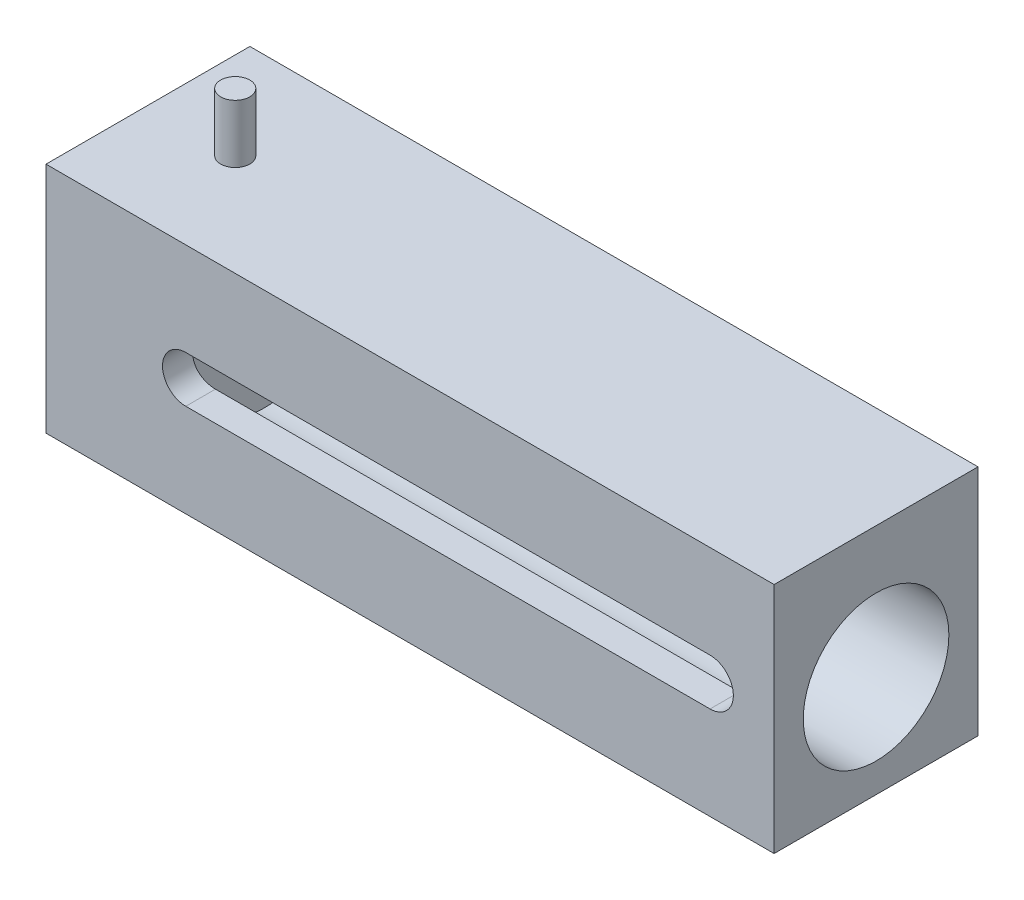
ISO-10303-21;
HEADER;
FILE_DESCRIPTION(('STEP AP214'),'2;1');
FILE_NAME('part.step','',(''),(''),'','','');
FILE_SCHEMA(('AUTOMOTIVE_DESIGN { 1 0 10303 214 1 1 1 1 }'));
ENDSEC;
DATA;
#1=APPLICATION_CONTEXT('core data for automotive mechanical design processes');
#2=APPLICATION_PROTOCOL_DEFINITION('international standard','automotive_design',2000,#1);
#3=PRODUCT_CONTEXT('',#1,'mechanical');
#4=PRODUCT('Part','Part','',(#3));
#5=PRODUCT_RELATED_PRODUCT_CATEGORY('part','',(#4));
#6=PRODUCT_DEFINITION_FORMATION('','',#4);
#7=PRODUCT_DEFINITION_CONTEXT('part definition',#1,'design');
#8=PRODUCT_DEFINITION('design','',#6,#7);
#9=PRODUCT_DEFINITION_SHAPE('','',#8);
#10=(LENGTH_UNIT() NAMED_UNIT(*) SI_UNIT(.MILLI.,.METRE.));
#11=(NAMED_UNIT(*) PLANE_ANGLE_UNIT() SI_UNIT($,.RADIAN.));
#12=(NAMED_UNIT(*) SI_UNIT($,.STERADIAN.) SOLID_ANGLE_UNIT());
#13=UNCERTAINTY_MEASURE_WITH_UNIT(LENGTH_MEASURE(1.E-05),#10,'distance_accuracy_value','');
#14=(GEOMETRIC_REPRESENTATION_CONTEXT(3) GLOBAL_UNCERTAINTY_ASSIGNED_CONTEXT((#13)) GLOBAL_UNIT_ASSIGNED_CONTEXT((#10,
#11,#12)) REPRESENTATION_CONTEXT('',''));
#15=CARTESIAN_POINT('',(0.,0.,0.));
#16=DIRECTION('',(0.,0.,1.));
#17=DIRECTION('',(1.,0.,0.));
#18=AXIS2_PLACEMENT_3D('',#15,#16,#17);
#19=CARTESIAN_POINT('',(125.,80.,-35.));
#20=DIRECTION('',(-1.,0.,0.));
#21=DIRECTION('',(0.,0.,1.));
#22=AXIS2_PLACEMENT_3D('',#19,#20,#21);
#23=PLANE('',#22);
#24=CARTESIAN_POINT('',(125.,35.,0.));
#25=DIRECTION('',(1.,0.,0.));
#26=DIRECTION('',(0.,0.,-1.));
#27=AXIS2_PLACEMENT_3D('',#24,#25,#26);
#28=CIRCLE('',#27,25.);
#29=CARTESIAN_POINT('',(125.,35.,-25.));
#30=VERTEX_POINT('',#29);
#31=EDGE_CURVE('E116',#30,#30,#28,.T.);
#32=ORIENTED_EDGE('',*,*,#31,.F.);
#33=EDGE_LOOP('',(#32));
#34=FACE_BOUND('',#33,.T.);
#35=DIRECTION('',(0.,0.,-1.));
#36=VECTOR('',#35,1.);
#37=CARTESIAN_POINT('',(125.,0.,-35.));
#38=LINE('',#37,#36);
#39=CARTESIAN_POINT('',(125.,0.,35.));
#40=VERTEX_POINT('',#39);
#41=CARTESIAN_POINT('',(125.,0.,-35.));
#42=VERTEX_POINT('',#41);
#43=EDGE_CURVE('E183',#40,#42,#38,.T.);
#44=ORIENTED_EDGE('',*,*,#43,.T.);
#45=DIRECTION('',(0.,-1.,0.));
#46=VECTOR('',#45,1.);
#47=CARTESIAN_POINT('',(125.,80.,-35.));
#48=LINE('',#47,#46);
#49=CARTESIAN_POINT('',(125.,80.,-35.));
#50=VERTEX_POINT('',#49);
#51=EDGE_CURVE('E12',#50,#42,#48,.T.);
#52=ORIENTED_EDGE('',*,*,#51,.F.);
#53=DIRECTION('',(0.,0.,-1.));
#54=VECTOR('',#53,1.);
#55=CARTESIAN_POINT('',(125.,80.,-35.));
#56=LINE('',#55,#54);
#57=CARTESIAN_POINT('',(125.,80.,35.));
#58=VERTEX_POINT('',#57);
#59=EDGE_CURVE('E203',#58,#50,#56,.T.);
#60=ORIENTED_EDGE('',*,*,#59,.F.);
#61=DIRECTION('',(0.,-1.,0.));
#62=VECTOR('',#61,1.);
#63=CARTESIAN_POINT('',(125.,80.,35.));
#64=LINE('',#63,#62);
#65=EDGE_CURVE('E186',#58,#40,#64,.T.);
#66=ORIENTED_EDGE('',*,*,#65,.T.);
#67=EDGE_LOOP('',(#44,#52,#60,#66));
#68=FACE_BOUND('',#67,.T.);
#69=ADVANCED_FACE('F37',(#34,#68),#23,.F.);
#70=CARTESIAN_POINT('',(-125.,80.,-35.));
#71=DIRECTION('',(0.,0.,1.));
#72=DIRECTION('',(1.,0.,0.));
#73=AXIS2_PLACEMENT_3D('',#70,#71,#72);
#74=PLANE('',#73);
#75=DIRECTION('',(-1.,0.,0.));
#76=VECTOR('',#75,1.);
#77=CARTESIAN_POINT('',(-125.,0.,-35.));
#78=LINE('',#77,#76);
#79=CARTESIAN_POINT('',(-125.,0.,-35.));
#80=VERTEX_POINT('',#79);
#81=EDGE_CURVE('E189',#42,#80,#78,.T.);
#82=ORIENTED_EDGE('',*,*,#81,.T.);
#83=DIRECTION('',(0.,-1.,0.));
#84=VECTOR('',#83,1.);
#85=CARTESIAN_POINT('',(-125.,80.,-35.));
#86=LINE('',#85,#84);
#87=CARTESIAN_POINT('',(-125.,80.,-35.));
#88=VERTEX_POINT('',#87);
#89=EDGE_CURVE('E44',#88,#80,#86,.T.);
#90=ORIENTED_EDGE('',*,*,#89,.F.);
#91=DIRECTION('',(-1.,0.,0.));
#92=VECTOR('',#91,1.);
#93=CARTESIAN_POINT('',(-125.,80.,-35.));
#94=LINE('',#93,#92);
#95=EDGE_CURVE('E220',#50,#88,#94,.T.);
#96=ORIENTED_EDGE('',*,*,#95,.F.);
#97=ORIENTED_EDGE('',*,*,#51,.T.);
#98=EDGE_LOOP('',(#82,#90,#96,#97));
#99=FACE_BOUND('',#98,.T.);
#100=ADVANCED_FACE('F167',(#99),#74,.F.);
#101=CARTESIAN_POINT('',(-125.,80.,-35.));
#102=DIRECTION('',(1.,0.,0.));
#103=DIRECTION('',(0.,0.,-1.));
#104=AXIS2_PLACEMENT_3D('',#101,#102,#103);
#105=PLANE('',#104);
#106=DIRECTION('',(0.,0.,1.));
#107=VECTOR('',#106,1.);
#108=CARTESIAN_POINT('',(-125.,0.,-35.));
#109=LINE('',#108,#107);
#110=CARTESIAN_POINT('',(-125.,0.,35.));
#111=VERTEX_POINT('',#110);
#112=EDGE_CURVE('E192',#80,#111,#109,.T.);
#113=ORIENTED_EDGE('',*,*,#112,.T.);
#114=DIRECTION('',(0.,-1.,0.));
#115=VECTOR('',#114,1.);
#116=CARTESIAN_POINT('',(-125.,80.,35.));
#117=LINE('',#116,#115);
#118=CARTESIAN_POINT('',(-125.,80.,35.));
#119=VERTEX_POINT('',#118);
#120=EDGE_CURVE('E205',#119,#111,#117,.T.);
#121=ORIENTED_EDGE('',*,*,#120,.F.);
#122=DIRECTION('',(0.,0.,1.));
#123=VECTOR('',#122,1.);
#124=CARTESIAN_POINT('',(-125.,80.,-35.));
#125=LINE('',#124,#123);
#126=EDGE_CURVE('E213',#88,#119,#125,.T.);
#127=ORIENTED_EDGE('',*,*,#126,.F.);
#128=ORIENTED_EDGE('',*,*,#89,.T.);
#129=EDGE_LOOP('',(#113,#121,#127,#128));
#130=FACE_BOUND('',#129,.T.);
#131=ADVANCED_FACE('F174',(#130),#105,.F.);
#132=CARTESIAN_POINT('',(-125.,80.,35.));
#133=DIRECTION('',(0.,0.,-1.));
#134=DIRECTION('',(-1.,0.,0.));
#135=AXIS2_PLACEMENT_3D('',#132,#133,#134);
#136=PLANE('',#135);
#137=DIRECTION('',(-1.,0.,0.));
#138=VECTOR('',#137,1.);
#139=CARTESIAN_POINT('',(103.,48.,35.));
#140=LINE('',#139,#138);
#141=CARTESIAN_POINT('',(103.,48.,35.));
#142=VERTEX_POINT('',#141);
#143=CARTESIAN_POINT('',(-77.,48.,35.));
#144=VERTEX_POINT('',#143);
#145=EDGE_CURVE('E125',#142,#144,#140,.T.);
#146=ORIENTED_EDGE('',*,*,#145,.F.);
#147=CARTESIAN_POINT('',(103.,40.,35.));
#148=DIRECTION('',(0.,0.,1.));
#149=DIRECTION('',(1.,0.,0.));
#150=AXIS2_PLACEMENT_3D('',#147,#148,#149);
#151=CIRCLE('',#150,8.);
#152=CARTESIAN_POINT('',(103.,32.,35.));
#153=VERTEX_POINT('',#152);
#154=EDGE_CURVE('E51',#153,#142,#151,.T.);
#155=ORIENTED_EDGE('',*,*,#154,.F.);
#156=DIRECTION('',(1.,0.,0.));
#157=VECTOR('',#156,1.);
#158=CARTESIAN_POINT('',(103.,32.,35.));
#159=LINE('',#158,#157);
#160=CARTESIAN_POINT('',(-77.,32.,35.));
#161=VERTEX_POINT('',#160);
#162=EDGE_CURVE('E109',#161,#153,#159,.T.);
#163=ORIENTED_EDGE('',*,*,#162,.F.);
#164=CARTESIAN_POINT('',(-77.,40.,35.));
#165=DIRECTION('',(0.,0.,1.));
#166=DIRECTION('',(1.,0.,0.));
#167=AXIS2_PLACEMENT_3D('',#164,#165,#166);
#168=CIRCLE('',#167,7.99999999999999);
#169=EDGE_CURVE('E231',#144,#161,#168,.T.);
#170=ORIENTED_EDGE('',*,*,#169,.F.);
#171=EDGE_LOOP('',(#146,#155,#163,#170));
#172=FACE_BOUND('',#171,.T.);
#173=DIRECTION('',(1.,0.,0.));
#174=VECTOR('',#173,1.);
#175=CARTESIAN_POINT('',(-125.,0.,35.));
#176=LINE('',#175,#174);
#177=EDGE_CURVE('E201',#111,#40,#176,.T.);
#178=ORIENTED_EDGE('',*,*,#177,.T.);
#179=ORIENTED_EDGE('',*,*,#65,.F.);
#180=DIRECTION('',(1.,0.,0.));
#181=VECTOR('',#180,1.);
#182=CARTESIAN_POINT('',(-125.,80.,35.));
#183=LINE('',#182,#181);
#184=EDGE_CURVE('E197',#119,#58,#183,.T.);
#185=ORIENTED_EDGE('',*,*,#184,.F.);
#186=ORIENTED_EDGE('',*,*,#120,.T.);
#187=EDGE_LOOP('',(#178,#179,#185,#186));
#188=FACE_BOUND('',#187,.T.);
#189=ADVANCED_FACE('F216',(#172,#188),#136,.F.);
#190=CARTESIAN_POINT('',(0.,80.,0.));
#191=DIRECTION('',(0.,1.,0.));
#192=DIRECTION('',(0.,0.,1.));
#193=AXIS2_PLACEMENT_3D('',#190,#191,#192);
#194=PLANE('',#193);
#195=CARTESIAN_POINT('',(-95.0269530255967,80.,0.));
#196=DIRECTION('',(0.,1.,0.));
#197=DIRECTION('',(0.,0.,1.));
#198=AXIS2_PLACEMENT_3D('',#195,#196,#197);
#199=CIRCLE('',#198,5.);
#200=CARTESIAN_POINT('',(-95.0269530255967,80.,5.));
#201=VERTEX_POINT('',#200);
#202=EDGE_CURVE('E154',#201,#201,#199,.T.);
#203=ORIENTED_EDGE('',*,*,#202,.F.);
#204=EDGE_LOOP('',(#203));
#205=FACE_BOUND('',#204,.T.);
#206=ORIENTED_EDGE('',*,*,#59,.T.);
#207=ORIENTED_EDGE('',*,*,#95,.T.);
#208=ORIENTED_EDGE('',*,*,#126,.T.);
#209=ORIENTED_EDGE('',*,*,#184,.T.);
#210=EDGE_LOOP('',(#206,#207,#208,#209));
#211=FACE_BOUND('',#210,.T.);
#212=ADVANCED_FACE('F244',(#205,#211),#194,.T.);
#213=CARTESIAN_POINT('',(0.,0.,0.));
#214=DIRECTION('',(0.,1.,0.));
#215=DIRECTION('',(0.,0.,1.));
#216=AXIS2_PLACEMENT_3D('',#213,#214,#215);
#217=PLANE('',#216);
#218=ORIENTED_EDGE('',*,*,#43,.F.);
#219=ORIENTED_EDGE('',*,*,#177,.F.);
#220=ORIENTED_EDGE('',*,*,#112,.F.);
#221=ORIENTED_EDGE('',*,*,#81,.F.);
#222=EDGE_LOOP('',(#218,#219,#220,#221));
#223=FACE_BOUND('',#222,.T.);
#224=ADVANCED_FACE('F214',(#223),#217,.F.);
#225=CARTESIAN_POINT('',(-195.710678118655,35.,0.));
#226=DIRECTION('',(1.,0.,0.));
#227=DIRECTION('',(0.,0.,-1.));
#228=AXIS2_PLACEMENT_3D('',#225,#226,#227);
#229=CYLINDRICAL_SURFACE('',#228,25.);
#230=CARTESIAN_POINT('',(-77.,32.,24.8193472919817));
#231=CARTESIAN_POINT('',(-77.2245260800568,31.9999748854294,24.8193211373583));
#232=CARTESIAN_POINT('',(-77.4490464566961,32.0094511606857,24.8204889781693));
#233=CARTESIAN_POINT('',(-77.8964561302221,32.0472235020739,24.8250232461733));
#234=CARTESIAN_POINT('',(-78.1193455762306,32.0755178253035,24.8283894697546));
#235=CARTESIAN_POINT('',(-78.5616926819431,32.1507053964551,24.8371267551841));
#236=CARTESIAN_POINT('',(-78.78115357651,32.1975798548235,24.8424957913237));
#237=CARTESIAN_POINT('',(-79.2153195965953,32.3095765657465,24.8548750589774));
#238=CARTESIAN_POINT('',(-79.4300247294152,32.3746987902829,24.8618852879715));
#239=CARTESIAN_POINT('',(-79.8531941030747,32.5227319326336,24.8770711422786));
#240=CARTESIAN_POINT('',(-80.0616576885741,32.6056447109805,24.8852468894512));
#241=CARTESIAN_POINT('',(-80.4709397595264,32.7886998574056,24.9021806204125));
#242=CARTESIAN_POINT('',(-80.6717555530182,32.8888482250512,24.9109388062898));
#243=CARTESIAN_POINT('',(-81.0642313309585,33.1056347572543,24.9283612833396));
#244=CARTESIAN_POINT('',(-81.2558931586097,33.2222695832829,24.9370255931407));
#245=CARTESIAN_POINT('',(-81.6287712449343,33.4712380751419,24.9535257007075));
#246=CARTESIAN_POINT('',(-81.8099875506092,33.603571670325,24.9613615022013));
#247=CARTESIAN_POINT('',(-82.1614378420823,33.8836078441429,24.9754559122939));
#248=CARTESIAN_POINT('',(-82.3316228898986,34.0313721995197,24.9817078089839));
#249=CARTESIAN_POINT('',(-82.6589018806299,34.3407146052504,24.991784150674));
#250=CARTESIAN_POINT('',(-82.8160005793631,34.5022875936646,24.9956094809055));
#251=CARTESIAN_POINT('',(-83.1160630211281,34.8381693469239,25.0000403595048));
#252=CARTESIAN_POINT('',(-83.259023919529,35.0124806625962,25.0006452611867));
#253=CARTESIAN_POINT('',(-83.5297161078201,35.3725243549313,24.9978724282155));
#254=CARTESIAN_POINT('',(-83.657447657134,35.5582565369643,24.994494761414));
#255=CARTESIAN_POINT('',(-83.895045232494,35.937042025933,24.983141133014));
#256=CARTESIAN_POINT('',(-84.0051376615767,36.1299552733757,24.9752306438333));
#257=CARTESIAN_POINT('',(-84.2088095542962,36.5240455063397,24.9542824707746));
#258=CARTESIAN_POINT('',(-84.3023891761551,36.7252224126577,24.9412448360277));
#259=CARTESIAN_POINT('',(-84.4723736102179,37.1342251194664,24.9095792786223));
#260=CARTESIAN_POINT('',(-84.5487825026526,37.3420493269413,24.8909526865135));
#261=CARTESIAN_POINT('',(-84.6839786684056,37.7627502577972,24.8477748927096));
#262=CARTESIAN_POINT('',(-84.7427662290126,37.9756268987452,24.8232237876163));
#263=CARTESIAN_POINT('',(-84.8412259007263,38.3995672593601,24.7686800531913));
#264=CARTESIAN_POINT('',(-84.8813251642343,38.6105507103877,24.7388330742105));
#265=CARTESIAN_POINT('',(-84.9443813776971,39.0342396482769,24.67328265034));
#266=CARTESIAN_POINT('',(-84.9673321794353,39.2469457251477,24.6375771105779));
#267=CARTESIAN_POINT('',(-84.9961320049039,39.6724011139694,24.5604437029626));
#268=CARTESIAN_POINT('',(-85.0019865096706,39.8851503901903,24.5190176735477));
#269=CARTESIAN_POINT('',(-84.9968309462422,40.3093747263832,24.4306672861814));
#270=CARTESIAN_POINT('',(-84.9858144925107,40.5208492734615,24.3837408525753));
#271=CARTESIAN_POINT('',(-84.9469859692602,40.9440324015302,24.2840770299713));
#272=CARTESIAN_POINT('',(-84.9189394582065,41.1557023039256,24.2312670867134));
#273=CARTESIAN_POINT('',(-84.8463162917128,41.5749956194294,24.1208717532073));
#274=CARTESIAN_POINT('',(-84.8017335777673,41.7826175200561,24.0632846187109));
#275=CARTESIAN_POINT('',(-84.6966001693498,42.192511544317,23.9439624137565));
#276=CARTESIAN_POINT('',(-84.6360520521071,42.3947845256118,23.882228013972));
#277=CARTESIAN_POINT('',(-84.4995595919977,42.7930146385798,23.7552651669223));
#278=CARTESIAN_POINT('',(-84.4236096970755,42.9889694630674,23.6900354659222));
#279=CARTESIAN_POINT('',(-84.2514436665598,43.3862167729867,23.5524608166496));
#280=CARTESIAN_POINT('',(-84.15422148591,43.5870093445621,23.4799303023795));
#281=CARTESIAN_POINT('',(-83.9436962598583,43.9792787314284,23.3327338308314));
#282=CARTESIAN_POINT('',(-83.8303858630872,44.1707512339878,23.2580669098646));
#283=CARTESIAN_POINT('',(-83.588404872122,44.5433783961512,23.1076677677544));
#284=CARTESIAN_POINT('',(-83.4597296758299,44.7245299402793,23.0319352334582));
#285=CARTESIAN_POINT('',(-83.1877479309835,45.0755369056875,22.8805614629323));
#286=CARTESIAN_POINT('',(-83.0444410712843,45.2453920866215,22.8049202286787));
#287=CARTESIAN_POINT('',(-82.7343552242769,45.5832807543733,22.6501841843929));
#288=CARTESIAN_POINT('',(-82.5666646020426,45.7505180563924,22.5711739227603));
#289=CARTESIAN_POINT('',(-82.2163104008082,46.0701185630938,22.4161555992865));
#290=CARTESIAN_POINT('',(-82.033644113942,46.2224790668262,22.3401480840933));
#291=CARTESIAN_POINT('',(-81.6541542844153,46.5111991999905,22.1927596636842));
#292=CARTESIAN_POINT('',(-81.4573238175003,46.6475509165276,22.1213810542023));
#293=CARTESIAN_POINT('',(-81.0507091853898,46.9028503487069,21.9850651894816));
#294=CARTESIAN_POINT('',(-80.8409321826184,47.0218075669373,21.9201244235508));
#295=CARTESIAN_POINT('',(-80.417010249892,47.2373067623288,21.8005273312814));
#296=CARTESIAN_POINT('',(-80.2032652848474,47.3344801629408,21.745593615609));
#297=CARTESIAN_POINT('',(-79.7662752026493,47.5102019288461,21.644978767877));
#298=CARTESIAN_POINT('',(-79.5430358168876,47.5887613475734,21.5992921470298));
#299=CARTESIAN_POINT('',(-79.0892174342473,47.7260102841244,21.5187126445142));
#300=CARTESIAN_POINT('',(-78.8586571470962,47.7847465937995,21.4837943615681));
#301=CARTESIAN_POINT('',(-78.39190234116,47.8815823666578,21.4258730542548));
#302=CARTESIAN_POINT('',(-78.1557122176046,47.9196974113859,21.4028610340239));
#303=CARTESIAN_POINT('',(-77.7657536974513,47.9647409696472,21.3755913816049));
#304=CARTESIAN_POINT('',(-77.6129412083004,47.977957669817,21.3675640924917));
#305=CARTESIAN_POINT('',(-77.306762020463,47.9955875201653,21.3568428711782));
#306=CARTESIAN_POINT('',(-77.1533959446838,48.0000085864376,21.3541441432751));
#307=CARTESIAN_POINT('',(-77.,48.,21.3541565040626));
#308=B_SPLINE_CURVE_WITH_KNOTS('',3,(#230,#231,#232,#233,#234,#235,#236,#237,#238,#239,#240,
#241,#242,#243,#244,#245,#246,#247,#248,#249,#250,#251,#252,#253,#254,#255,#256,#257,#258,#259,
#260,#261,#262,#263,#264,#265,#266,#267,#268,#269,#270,#271,#272,#273,#274,#275,#276,#277,#278,
#279,#280,#281,#282,#283,#284,#285,#286,#287,#288,#289,#290,#291,#292,#293,#294,#295,#296,#297,
#298,#299,#300,#301,#302,#303,#304,#305,#306,#307),.UNSPECIFIED.,.F.,.F.,(4,2,2,2,2,2,2,2,2,2,2,
2,2,2,2,2,2,2,2,2,2,2,2,2,2,2,2,2,2,2,2,2,2,2,2,2,2,2,4),(0.,0.673366850420222,1.34667134318694,
2.01929667264862,2.69192096934419,3.36461564327053,4.03754495207278,4.71033818653299,
5.38312839341777,6.05872362689813,6.7340722557346,7.40955649446239,8.0850292250392,
8.75098283479679,9.41693006318187,10.0827188767208,10.748496835007,11.3982044149081,
12.0481448220347,12.6978768367689,13.3478548311802,14.0069901632439,14.6663672270975,
15.3256379155195,15.9851466826245,16.6881386735067,17.3914529304301,18.0949783764826,
18.7985187862445,19.5466017647124,20.2948203094626,21.0434071437602,21.7915834859672,
22.5139642527381,23.2359149711327,23.956149428707,24.6758389102671,25.1362966289323,
25.5963397466176),.UNSPECIFIED.);
#309=CARTESIAN_POINT('',(-77.,32.,24.8193472919817));
#310=VERTEX_POINT('',#309);
#311=CARTESIAN_POINT('',(-85.,40.,24.4948974278318));
#312=VERTEX_POINT('',#311);
#313=EDGE_CURVE('E127',#310,#312,#308,.T.);
#314=ORIENTED_EDGE('',*,*,#313,.F.);
#315=DIRECTION('',(1.,0.,0.));
#316=VECTOR('',#315,1.);
#317=CARTESIAN_POINT('',(-195.710678118655,32.,24.8193472919817));
#318=LINE('',#317,#316);
#319=CARTESIAN_POINT('',(103.,32.,24.8193472919817));
#320=VERTEX_POINT('',#319);
#321=EDGE_CURVE('E123',#320,#310,#318,.F.);
#322=ORIENTED_EDGE('',*,*,#321,.F.);
#323=CARTESIAN_POINT('',(103.,48.,21.3541565040626));
#324=CARTESIAN_POINT('',(103.205849807189,48.0000396443062,21.3541073924731));
#325=CARTESIAN_POINT('',(103.411674033264,47.9920567055715,21.3589916302539));
#326=CARTESIAN_POINT('',(103.821547718985,47.9603463833976,21.3782611311748));
#327=CARTESIAN_POINT('',(104.025598097051,47.9366277082404,21.3926411392595));
#328=CARTESIAN_POINT('',(104.429285972684,47.8739239892701,21.4304300030837));
#329=CARTESIAN_POINT('',(104.628941910676,47.8350261158899,21.4537872931311));
#330=CARTESIAN_POINT('',(105.023629115418,47.7424809022371,21.5088841183818));
#331=CARTESIAN_POINT('',(105.218659932087,47.6888321328676,21.5406244657408));
#332=CARTESIAN_POINT('',(105.602433248827,47.5675455746762,21.6116105306421));
#333=CARTESIAN_POINT('',(105.791188477242,47.4999383974715,21.6508398105544));
#334=CARTESIAN_POINT('',(106.161848965753,47.3513694654702,21.7359381005676));
#335=CARTESIAN_POINT('',(106.343751565691,47.2704025888035,21.7818096563694));
#336=CARTESIAN_POINT('',(106.878143303202,47.0083738141704,21.9280405761579));
#337=CARTESIAN_POINT('',(107.219155406554,46.8082353056478,22.0369851473718));
#338=CARTESIAN_POINT('',(107.889977030806,46.3456504011617,22.2789031591776));
#339=CARTESIAN_POINT('',(108.216787132402,46.0795372889478,22.4130935013286));
#340=CARTESIAN_POINT('',(108.823231207482,45.501395097406,22.6897152490284));
#341=CARTESIAN_POINT('',(109.102848498635,45.1893498540586,22.8321495449638));
#342=CARTESIAN_POINT('',(109.497770174976,44.6726137338677,23.0538781508343));
#343=CARTESIAN_POINT('',(109.631077407896,44.481427118998,23.1332566004175));
#344=CARTESIAN_POINT('',(109.880714550654,44.0877897706131,23.2907047143709));
#345=CARTESIAN_POINT('',(109.997049823486,43.885342623382,23.3687747852454));
#346=CARTESIAN_POINT('',(110.211969658486,43.4701835576206,23.5224366622562));
#347=CARTESIAN_POINT('',(110.310544178503,43.2574659176681,23.5980270467151));
#348=CARTESIAN_POINT('',(110.488968608048,42.823193692911,23.7455299226442));
#349=CARTESIAN_POINT('',(110.568826691737,42.601643015475,23.8174440089201));
#350=CARTESIAN_POINT('',(110.709336672628,42.1499593868407,23.956923885457));
#351=CARTESIAN_POINT('',(110.769897477906,41.9197913001032,24.0244678869876));
#352=CARTESIAN_POINT('',(110.870477131256,41.453438915139,24.1539164114699));
#353=CARTESIAN_POINT('',(110.910495626321,41.2172545135984,24.2158208374936));
#354=CARTESIAN_POINT('',(110.969243669047,40.7407750891517,24.3331804708289));
#355=CARTESIAN_POINT('',(110.987982820499,40.500481970336,24.3886385773404));
#356=CARTESIAN_POINT('',(111.003624699303,40.0176772088606,24.492526788105));
#357=CARTESIAN_POINT('',(111.000529225034,39.7751657505547,24.5409574708271));
#358=CARTESIAN_POINT('',(110.973187256327,39.3079371749882,24.6270968660943));
#359=CARTESIAN_POINT('',(110.950514257109,39.0832240791016,24.6653323705813));
#360=CARTESIAN_POINT('',(110.886024140865,38.6355368780787,24.7352822944936));
#361=CARTESIAN_POINT('',(110.844207915147,38.4125626924701,24.7669970174274));
#362=CARTESIAN_POINT('',(110.741553459949,37.9702502274594,24.8239265401235));
#363=CARTESIAN_POINT('',(110.680719892242,37.7509110708531,24.8491429300794));
#364=CARTESIAN_POINT('',(110.540349280603,37.31765371861,24.8932901726097));
#365=CARTESIAN_POINT('',(110.460812696519,37.1037353898353,24.9122211796944));
#366=CARTESIAN_POINT('',(110.288125602125,36.6939299030793,24.9433487600899));
#367=CARTESIAN_POINT('',(110.195884762135,36.4976810670002,24.9558414204334));
#368=CARTESIAN_POINT('',(109.99562346858,36.1130636159011,24.9759521805124));
#369=CARTESIAN_POINT('',(109.887597846185,35.9246976082557,24.9835686791037));
#370=CARTESIAN_POINT('',(109.656551058243,35.5573196225984,24.9944627453105));
#371=CARTESIAN_POINT('',(109.533532632971,35.3783059437545,24.9977411045251));
#372=CARTESIAN_POINT('',(109.273329450335,35.0308503196725,25.0005847790171));
#373=CARTESIAN_POINT('',(109.13614409015,34.8624088247846,25.0001499362287));
#374=CARTESIAN_POINT('',(108.847544855523,34.5361195050404,24.9962322650482));
#375=CARTESIAN_POINT('',(108.69603801805,34.3783541795117,24.9927281009275));
#376=CARTESIAN_POINT('',(108.380658997194,34.0757901470225,24.9833694882003));
#377=CARTESIAN_POINT('',(108.216786812093,33.9309914418635,24.9775150392673));
#378=CARTESIAN_POINT('',(107.877741225495,33.6552861630892,24.9641904202499));
#379=CARTESIAN_POINT('',(107.70256503386,33.5243830405346,24.9567198501839));
#380=CARTESIAN_POINT('',(107.342118213714,33.2773706763018,24.9408875144825));
#381=CARTESIAN_POINT('',(107.156847639674,33.1612613548038,24.932525753656));
#382=CARTESIAN_POINT('',(106.772617885158,32.9418466528833,24.9153853437699));
#383=CARTESIAN_POINT('',(106.573430714653,32.8389406535688,24.9066015001206));
#384=CARTESIAN_POINT('',(106.167180649956,32.6502303406198,24.889506999285));
#385=CARTESIAN_POINT('',(105.960120542679,32.5644200412303,24.8811961772092));
#386=CARTESIAN_POINT('',(105.539599408642,32.410498246014,24.8656484842175));
#387=CARTESIAN_POINT('',(105.326141645838,32.3423778909754,24.8584110765124));
#388=CARTESIAN_POINT('',(104.894296610824,32.224284786273,24.8455006967142));
#389=CARTESIAN_POINT('',(104.675910973998,32.1743061074461,24.8398272136367));
#390=CARTESIAN_POINT('',(104.215713443572,32.0891469072764,24.8300033087176));
#391=CARTESIAN_POINT('',(103.973571653042,32.0557172444818,24.8260374357875));
#392=CARTESIAN_POINT('',(103.487616806946,32.0111434566795,24.8206931662003));
#393=CARTESIAN_POINT('',(103.243807116746,31.9999631143874,24.8193105647371));
#394=CARTESIAN_POINT('',(103.,32.,24.8193472919817));
#395=B_SPLINE_CURVE_WITH_KNOTS('',3,(#323,#324,#325,#326,#327,#328,#329,#330,#331,#332,#333,
#334,#335,#336,#337,#338,#339,#340,#341,#342,#343,#344,#345,#346,#347,#348,#349,#350,#351,#352,
#353,#354,#355,#356,#357,#358,#359,#360,#361,#362,#363,#364,#365,#366,#367,#368,#369,#370,#371,
#372,#373,#374,#375,#376,#377,#378,#379,#380,#381,#382,#383,#384,#385,#386,#387,#388,#389,#390,
#391,#392,#393,#394),.UNSPECIFIED.,.F.,.F.,(4,2,2,2,2,2,2,2,2,2,2,2,2,2,2,2,2,2,2,2,2,2,2,2,2,2,
2,2,2,2,2,2,2,2,2,4),(0.,0.617296443034064,1.23425155393969,1.84771458198607,2.46123706453365,
3.07342808171663,3.68585434967496,4.9112167029632,6.23312179040774,7.55549318783064,
8.29343541130478,9.03114394391198,9.7692682860564,10.5070696587416,11.2483038947196,
11.989550867967,12.7304631685529,13.4713144456044,14.1576386546199,14.843930911577,
15.5300550675616,16.2161623556608,16.8670105923135,17.5180724330557,18.1690154553384,
18.8199861874754,19.4755182380017,20.1310503795966,20.7867449479327,21.44243597833,
22.1147553269799,22.7868388596647,23.4585851576416,24.1301117136827,24.8624758307151,
25.593646832359),.UNSPECIFIED.);
#396=CARTESIAN_POINT('',(103.,48.,21.3541565040626));
#397=VERTEX_POINT('',#396);
#398=EDGE_CURVE('E106',#397,#320,#395,.T.);
#399=ORIENTED_EDGE('',*,*,#398,.F.);
#400=DIRECTION('',(1.,0.,0.));
#401=VECTOR('',#400,1.);
#402=CARTESIAN_POINT('',(-195.710678118655,48.,21.3541565040626));
#403=LINE('',#402,#401);
#404=CARTESIAN_POINT('',(-77.,48.,21.3541565040626));
#405=VERTEX_POINT('',#404);
#406=EDGE_CURVE('E112',#405,#397,#403,.T.);
#407=ORIENTED_EDGE('',*,*,#406,.F.);
#408=EDGE_CURVE('E153',#312,#405,#308,.T.);
#409=ORIENTED_EDGE('',*,*,#408,.F.);
#410=CARTESIAN_POINT('',(-85.,35.,0.));
#411=DIRECTION('',(1.,0.,0.));
#412=DIRECTION('',(0.,0.,-1.));
#413=AXIS2_PLACEMENT_3D('',#410,#411,#412);
#414=CIRCLE('',#413,25.);
#415=EDGE_CURVE('E190',#312,#312,#414,.F.);
#416=ORIENTED_EDGE('',*,*,#415,.T.);
#417=EDGE_LOOP('',(#314,#322,#399,#407,#409,#416));
#418=FACE_BOUND('',#417,.T.);
#419=ORIENTED_EDGE('',*,*,#31,.T.);
#420=EDGE_LOOP('',(#419));
#421=FACE_BOUND('',#420,.T.);
#422=ADVANCED_FACE('F120',(#418,#421),#229,.F.);
#423=CARTESIAN_POINT('',(-85.,80.,-35.));
#424=DIRECTION('',(1.,0.,0.));
#425=DIRECTION('',(0.,0.,-1.));
#426=AXIS2_PLACEMENT_3D('',#423,#424,#425);
#427=PLANE('',#426);
#428=ORIENTED_EDGE('',*,*,#415,.F.);
#429=EDGE_LOOP('',(#428));
#430=FACE_BOUND('',#429,.T.);
#431=ADVANCED_FACE('F279',(#430),#427,.T.);
#432=CARTESIAN_POINT('',(103.,40.,-35.001));
#433=DIRECTION('',(0.,0.,1.));
#434=DIRECTION('',(1.,0.,0.));
#435=AXIS2_PLACEMENT_3D('',#432,#433,#434);
#436=CYLINDRICAL_SURFACE('',#435,8.);
#437=ORIENTED_EDGE('',*,*,#398,.T.);
#438=DIRECTION('',(0.,0.,1.));
#439=VECTOR('',#438,1.);
#440=CARTESIAN_POINT('',(103.,32.,-35.001));
#441=LINE('',#440,#439);
#442=EDGE_CURVE('E117',#320,#153,#441,.T.);
#443=ORIENTED_EDGE('',*,*,#442,.T.);
#444=ORIENTED_EDGE('',*,*,#154,.T.);
#445=DIRECTION('',(0.,0.,1.));
#446=VECTOR('',#445,1.);
#447=CARTESIAN_POINT('',(103.,48.,-35.001));
#448=LINE('',#447,#446);
#449=EDGE_CURVE('E103',#397,#142,#448,.T.);
#450=ORIENTED_EDGE('',*,*,#449,.F.);
#451=EDGE_LOOP('',(#437,#443,#444,#450));
#452=FACE_BOUND('',#451,.T.);
#453=ADVANCED_FACE('F104',(#452),#436,.F.);
#454=CARTESIAN_POINT('',(103.,32.,-35.001));
#455=DIRECTION('',(0.,-1.,0.));
#456=DIRECTION('',(1.,0.,0.));
#457=AXIS2_PLACEMENT_3D('',#454,#455,#456);
#458=PLANE('',#457);
#459=ORIENTED_EDGE('',*,*,#321,.T.);
#460=DIRECTION('',(0.,0.,1.));
#461=VECTOR('',#460,1.);
#462=CARTESIAN_POINT('',(-77.,32.,-35.001));
#463=LINE('',#462,#461);
#464=EDGE_CURVE('E226',#310,#161,#463,.T.);
#465=ORIENTED_EDGE('',*,*,#464,.T.);
#466=ORIENTED_EDGE('',*,*,#162,.T.);
#467=ORIENTED_EDGE('',*,*,#442,.F.);
#468=EDGE_LOOP('',(#459,#465,#466,#467));
#469=FACE_BOUND('',#468,.T.);
#470=ADVANCED_FACE('F145',(#469),#458,.F.);
#471=CARTESIAN_POINT('',(-77.,40.,-35.001));
#472=DIRECTION('',(0.,0.,1.));
#473=DIRECTION('',(1.,0.,0.));
#474=AXIS2_PLACEMENT_3D('',#471,#472,#473);
#475=CYLINDRICAL_SURFACE('',#474,7.99999999999999);
#476=ORIENTED_EDGE('',*,*,#313,.T.);
#477=ORIENTED_EDGE('',*,*,#408,.T.);
#478=DIRECTION('',(0.,0.,1.));
#479=VECTOR('',#478,1.);
#480=CARTESIAN_POINT('',(-77.,48.,-35.001));
#481=LINE('',#480,#479);
#482=EDGE_CURVE('E59',#405,#144,#481,.T.);
#483=ORIENTED_EDGE('',*,*,#482,.T.);
#484=ORIENTED_EDGE('',*,*,#169,.T.);
#485=ORIENTED_EDGE('',*,*,#464,.F.);
#486=EDGE_LOOP('',(#476,#477,#483,#484,#485));
#487=FACE_BOUND('',#486,.T.);
#488=ADVANCED_FACE('F156',(#487),#475,.F.);
#489=CARTESIAN_POINT('',(103.,48.,-35.001));
#490=DIRECTION('',(0.,1.,0.));
#491=DIRECTION('',(-1.,0.,0.));
#492=AXIS2_PLACEMENT_3D('',#489,#490,#491);
#493=PLANE('',#492);
#494=ORIENTED_EDGE('',*,*,#406,.T.);
#495=ORIENTED_EDGE('',*,*,#449,.T.);
#496=ORIENTED_EDGE('',*,*,#145,.T.);
#497=ORIENTED_EDGE('',*,*,#482,.F.);
#498=EDGE_LOOP('',(#494,#495,#496,#497));
#499=FACE_BOUND('',#498,.T.);
#500=ADVANCED_FACE('F113',(#499),#493,.F.);
#501=CARTESIAN_POINT('',(-95.0269530255967,100.,0.));
#502=DIRECTION('',(0.,-1.,0.));
#503=DIRECTION('',(0.,0.,-1.));
#504=AXIS2_PLACEMENT_3D('',#501,#502,#503);
#505=CYLINDRICAL_SURFACE('',#504,5.);
#506=CARTESIAN_POINT('',(-95.0269530255967,100.,0.));
#507=DIRECTION('',(0.,1.,0.));
#508=DIRECTION('',(0.,0.,1.));
#509=AXIS2_PLACEMENT_3D('',#506,#507,#508);
#510=CIRCLE('',#509,5.);
#511=CARTESIAN_POINT('',(-95.0269530255967,100.,5.));
#512=VERTEX_POINT('',#511);
#513=EDGE_CURVE('E236',#512,#512,#510,.T.);
#514=ORIENTED_EDGE('',*,*,#513,.F.);
#515=EDGE_LOOP('',(#514));
#516=FACE_BOUND('',#515,.T.);
#517=ORIENTED_EDGE('',*,*,#202,.T.);
#518=EDGE_LOOP('',(#517));
#519=FACE_BOUND('',#518,.T.);
#520=ADVANCED_FACE('F143',(#516,#519),#505,.T.);
#521=CARTESIAN_POINT('',(-95.0269530255967,100.,0.));
#522=DIRECTION('',(0.,1.,0.));
#523=DIRECTION('',(0.,0.,1.));
#524=AXIS2_PLACEMENT_3D('',#521,#522,#523);
#525=PLANE('',#524);
#526=ORIENTED_EDGE('',*,*,#513,.T.);
#527=EDGE_LOOP('',(#526));
#528=FACE_BOUND('',#527,.T.);
#529=ADVANCED_FACE('F164',(#528),#525,.T.);
#530=CLOSED_SHELL('',(#69,#100,#131,#189,#212,#224,#422,#431,#453,#470,#488,#500,#520,#529));
#531=MANIFOLD_SOLID_BREP('B2',#530);
#532=ADVANCED_BREP_SHAPE_REPRESENTATION('',(#18,#531),#14);
#533=SHAPE_DEFINITION_REPRESENTATION(#9,#532);
ENDSEC;
END-ISO-10303-21;
